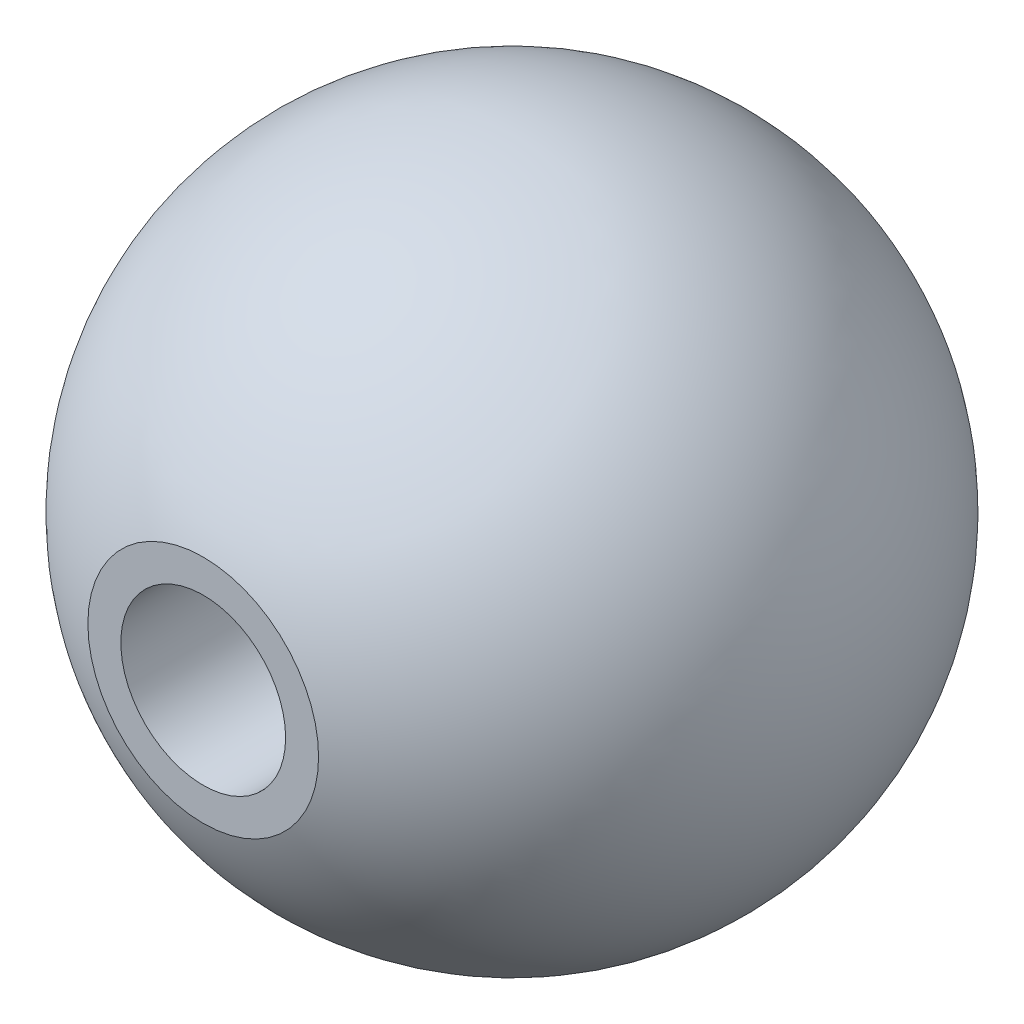
ISO-10303-21;
HEADER;
FILE_DESCRIPTION(('STEP AP214'),'2;1');
FILE_NAME('part.step','',(''),(''),'','','');
FILE_SCHEMA(('AUTOMOTIVE_DESIGN { 1 0 10303 214 1 1 1 1 }'));
ENDSEC;
DATA;
#1=APPLICATION_CONTEXT('core data for automotive mechanical design processes');
#2=APPLICATION_PROTOCOL_DEFINITION('international standard','automotive_design',2000,#1);
#3=PRODUCT_CONTEXT('',#1,'mechanical');
#4=PRODUCT('Part','Part','',(#3));
#5=PRODUCT_RELATED_PRODUCT_CATEGORY('part','',(#4));
#6=PRODUCT_DEFINITION_FORMATION('','',#4);
#7=PRODUCT_DEFINITION_CONTEXT('part definition',#1,'design');
#8=PRODUCT_DEFINITION('design','',#6,#7);
#9=PRODUCT_DEFINITION_SHAPE('','',#8);
#10=(LENGTH_UNIT() NAMED_UNIT(*) SI_UNIT(.MILLI.,.METRE.));
#11=(NAMED_UNIT(*) PLANE_ANGLE_UNIT() SI_UNIT($,.RADIAN.));
#12=(NAMED_UNIT(*) SI_UNIT($,.STERADIAN.) SOLID_ANGLE_UNIT());
#13=UNCERTAINTY_MEASURE_WITH_UNIT(LENGTH_MEASURE(1.E-05),#10,'distance_accuracy_value','');
#14=(GEOMETRIC_REPRESENTATION_CONTEXT(3) GLOBAL_UNCERTAINTY_ASSIGNED_CONTEXT((#13)) GLOBAL_UNIT_ASSIGNED_CONTEXT((#10,
#11,#12)) REPRESENTATION_CONTEXT('',''));
#15=CARTESIAN_POINT('',(0.,0.,0.));
#16=DIRECTION('',(0.,0.,1.));
#17=DIRECTION('',(1.,0.,0.));
#18=AXIS2_PLACEMENT_3D('',#15,#16,#17);
#19=CARTESIAN_POINT('',(0.,0.,0.));
#20=DIRECTION('',(0.,-1.,0.));
#21=DIRECTION('',(1.,0.,0.));
#22=AXIS2_PLACEMENT_3D('',#19,#20,#21);
#23=SPHERICAL_SURFACE('',#22,12.7);
#24=CARTESIAN_POINT('',(0.,0.,0.));
#25=DIRECTION('',(0.,0.,1.));
#26=DIRECTION('',(1.,0.,0.));
#27=AXIS2_PLACEMENT_3D('',#24,#25,#26);
#28=SPHERICAL_SURFACE('',#27,12.7);
#29=CARTESIAN_POINT('',(0.,0.,-11.8967211869489));
#30=DIRECTION('',(0.,0.,1.));
#31=DIRECTION('',(1.,0.,0.));
#32=AXIS2_PLACEMENT_3D('',#29,#30,#31);
#33=CIRCLE('',#32,4.445);
#34=CARTESIAN_POINT('',(4.445,0.,-11.8967211869489));
#35=VERTEX_POINT('',#34);
#36=EDGE_CURVE('E61',#35,#35,#33,.T.);
#37=ORIENTED_EDGE('',*,*,#36,.T.);
#38=EDGE_LOOP('',(#37));
#39=FACE_BOUND('',#38,.T.);
#40=CARTESIAN_POINT('',(0.,0.,11.8967211869489));
#41=DIRECTION('',(0.,0.,-1.));
#42=DIRECTION('',(-1.,0.,0.));
#43=AXIS2_PLACEMENT_3D('',#40,#41,#42);
#44=CIRCLE('',#43,4.445);
#45=CARTESIAN_POINT('',(-4.445,0.,11.8967211869489));
#46=VERTEX_POINT('',#45);
#47=EDGE_CURVE('E10',#46,#46,#44,.T.);
#48=ORIENTED_EDGE('',*,*,#47,.T.);
#49=EDGE_LOOP('',(#48));
#50=FACE_BOUND('',#49,.T.);
#51=ADVANCED_FACE('F43',(#39,#50),#28,.T.);
#52=CARTESIAN_POINT('',(0.,0.,11.8967211869489));
#53=DIRECTION('',(0.,0.,-1.));
#54=DIRECTION('',(-1.,0.,0.));
#55=AXIS2_PLACEMENT_3D('',#52,#53,#54);
#56=PLANE('',#55);
#57=CARTESIAN_POINT('',(0.,0.,11.8967211869489));
#58=DIRECTION('',(0.,0.,1.));
#59=DIRECTION('',(1.,0.,0.));
#60=AXIS2_PLACEMENT_3D('',#57,#58,#59);
#61=CIRCLE('',#60,3.175);
#62=CARTESIAN_POINT('',(3.175,0.,11.8967211869489));
#63=VERTEX_POINT('',#62);
#64=EDGE_CURVE('E55',#63,#63,#61,.T.);
#65=ORIENTED_EDGE('',*,*,#64,.F.);
#66=EDGE_LOOP('',(#65));
#67=FACE_BOUND('',#66,.T.);
#68=ORIENTED_EDGE('',*,*,#47,.F.);
#69=EDGE_LOOP('',(#68));
#70=FACE_BOUND('',#69,.T.);
#71=ADVANCED_FACE('F87',(#67,#70),#56,.F.);
#72=CARTESIAN_POINT('',(0.,0.,4.27672118694895));
#73=DIRECTION('',(0.,0.,1.));
#74=DIRECTION('',(1.,0.,0.));
#75=AXIS2_PLACEMENT_3D('',#72,#73,#74);
#76=CYLINDRICAL_SURFACE('',#75,3.175);
#77=CARTESIAN_POINT('',(0.,0.,4.27672118694895));
#78=DIRECTION('',(0.,0.,1.));
#79=DIRECTION('',(1.,0.,0.));
#80=AXIS2_PLACEMENT_3D('',#77,#78,#79);
#81=CIRCLE('',#80,3.175);
#82=CARTESIAN_POINT('',(3.175,0.,4.27672118694895));
#83=VERTEX_POINT('',#82);
#84=EDGE_CURVE('E50',#83,#83,#81,.T.);
#85=CARTESIAN_POINT('',(3.175,0.,4.27672118694895));
#86=CARTESIAN_POINT('',(3.175,0.,4.35609618694895));
#87=CARTESIAN_POINT('',(3.175,0.,4.43547118694895));
#88=CARTESIAN_POINT('',(3.175,0.,4.59422118694895));
#89=CARTESIAN_POINT('',(3.175,0.,4.67359618694895));
#90=CARTESIAN_POINT('',(3.175,0.,4.83234618694895));
#91=CARTESIAN_POINT('',(3.175,0.,4.91172118694895));
#92=CARTESIAN_POINT('',(3.175,0.,5.07047118694895));
#93=CARTESIAN_POINT('',(3.175,0.,5.14984618694895));
#94=CARTESIAN_POINT('',(3.175,0.,5.30859618694895));
#95=CARTESIAN_POINT('',(3.175,0.,5.38797118694895));
#96=CARTESIAN_POINT('',(3.175,0.,5.54672118694895));
#97=CARTESIAN_POINT('',(3.175,0.,5.62609618694895));
#98=CARTESIAN_POINT('',(3.175,0.,5.78484618694895));
#99=CARTESIAN_POINT('',(3.175,0.,5.86422118694895));
#100=CARTESIAN_POINT('',(3.175,0.,6.02297118694895));
#101=CARTESIAN_POINT('',(3.175,0.,6.10234618694895));
#102=CARTESIAN_POINT('',(3.175,0.,6.26109618694895));
#103=CARTESIAN_POINT('',(3.175,0.,6.34047118694895));
#104=CARTESIAN_POINT('',(3.175,0.,6.49922118694895));
#105=CARTESIAN_POINT('',(3.175,0.,6.57859618694895));
#106=CARTESIAN_POINT('',(3.175,0.,6.73734618694895));
#107=CARTESIAN_POINT('',(3.175,0.,6.81672118694895));
#108=CARTESIAN_POINT('',(3.175,0.,6.97547118694895));
#109=CARTESIAN_POINT('',(3.175,0.,7.05484618694895));
#110=CARTESIAN_POINT('',(3.175,0.,7.21359618694895));
#111=CARTESIAN_POINT('',(3.175,0.,7.29297118694895));
#112=CARTESIAN_POINT('',(3.175,0.,7.45172118694895));
#113=CARTESIAN_POINT('',(3.175,0.,7.53109618694895));
#114=CARTESIAN_POINT('',(3.175,0.,7.68984618694895));
#115=CARTESIAN_POINT('',(3.175,0.,7.76922118694895));
#116=CARTESIAN_POINT('',(3.175,0.,7.92797118694895));
#117=CARTESIAN_POINT('',(3.175,0.,8.00734618694895));
#118=CARTESIAN_POINT('',(3.175,0.,8.16609618694895));
#119=CARTESIAN_POINT('',(3.175,0.,8.24547118694895));
#120=CARTESIAN_POINT('',(3.175,0.,8.40422118694895));
#121=CARTESIAN_POINT('',(3.175,0.,8.48359618694895));
#122=CARTESIAN_POINT('',(3.175,0.,8.64234618694895));
#123=CARTESIAN_POINT('',(3.175,0.,8.72172118694895));
#124=CARTESIAN_POINT('',(3.175,0.,8.88047118694895));
#125=CARTESIAN_POINT('',(3.175,0.,8.95984618694895));
#126=CARTESIAN_POINT('',(3.175,0.,9.11859618694895));
#127=CARTESIAN_POINT('',(3.175,0.,9.19797118694895));
#128=CARTESIAN_POINT('',(3.175,0.,9.35672118694895));
#129=CARTESIAN_POINT('',(3.175,0.,9.43609618694895));
#130=CARTESIAN_POINT('',(3.175,0.,9.59484618694895));
#131=CARTESIAN_POINT('',(3.175,0.,9.67422118694895));
#132=CARTESIAN_POINT('',(3.175,0.,9.83297118694895));
#133=CARTESIAN_POINT('',(3.175,0.,9.91234618694895));
#134=CARTESIAN_POINT('',(3.175,0.,10.0710961869489));
#135=CARTESIAN_POINT('',(3.175,0.,10.1504711869489));
#136=CARTESIAN_POINT('',(3.175,0.,10.3092211869489));
#137=CARTESIAN_POINT('',(3.175,0.,10.3885961869489));
#138=CARTESIAN_POINT('',(3.175,0.,10.5473461869489));
#139=CARTESIAN_POINT('',(3.175,0.,10.6267211869489));
#140=CARTESIAN_POINT('',(3.175,0.,10.7854711869489));
#141=CARTESIAN_POINT('',(3.175,0.,10.8648461869489));
#142=CARTESIAN_POINT('',(3.175,0.,11.0235961869489));
#143=CARTESIAN_POINT('',(3.175,0.,11.1029711869489));
#144=CARTESIAN_POINT('',(3.175,0.,11.2617211869489));
#145=CARTESIAN_POINT('',(3.175,0.,11.3410961869489));
#146=CARTESIAN_POINT('',(3.175,0.,11.4998461869489));
#147=CARTESIAN_POINT('',(3.175,0.,11.5792211869489));
#148=CARTESIAN_POINT('',(3.175,0.,11.7379711869489));
#149=CARTESIAN_POINT('',(3.175,0.,11.8173461869489));
#150=CARTESIAN_POINT('',(3.175,0.,11.8967211869489));
#151=B_SPLINE_CURVE_WITH_KNOTS('',3,(#85,#86,#87,#88,#89,#90,#91,#92,#93,#94,#95,#96,#97,#98,
#99,#100,#101,#102,#103,#104,#105,#106,#107,#108,#109,#110,#111,#112,#113,#114,#115,#116,#117,
#118,#119,#120,#121,#122,#123,#124,#125,#126,#127,#128,#129,#130,#131,#132,#133,#134,#135,#136,
#137,#138,#139,#140,#141,#142,#143,#144,#145,#146,#147,#148,#149,#150),.UNSPECIFIED.,.F.,.F.,(4,
2,2,2,2,2,2,2,2,2,2,2,2,2,2,2,2,2,2,2,2,2,2,2,2,2,2,2,2,2,2,2,4),(0.,0.238125,0.476249999999999,
0.714374999999999,0.952499999999999,1.190625,1.42875,1.666875,1.905,2.143125,2.38125,2.619375,
2.8575,3.095625,3.33375,3.571875,3.81,4.048125,4.28625,4.524375,4.7625,5.000625,5.23875,
5.476875,5.715,5.953125,6.19125,6.429375,6.6675,6.905625,7.14375,7.381875,7.62),.UNSPECIFIED.);
#152=EDGE_CURVE('BSEAM94',#83,#63,#151,.T.);
#153=ORIENTED_EDGE('',*,*,#84,.F.);
#154=ORIENTED_EDGE('',*,*,#64,.T.);
#155=ORIENTED_EDGE('',*,*,#152,.T.);
#156=ORIENTED_EDGE('',*,*,#152,.F.);
#157=EDGE_LOOP('',(#153,#155,#154,#156));
#158=FACE_BOUND('',#157,.T.);
#159=ADVANCED_FACE('F94',(#158),#76,.F.);
#160=CARTESIAN_POINT('',(0.,0.,4.27672118694895));
#161=DIRECTION('',(0.,0.,1.));
#162=DIRECTION('',(1.,0.,0.));
#163=AXIS2_PLACEMENT_3D('',#160,#161,#162);
#164=PLANE('',#163);
#165=ORIENTED_EDGE('',*,*,#84,.T.);
#166=EDGE_LOOP('',(#165));
#167=FACE_BOUND('',#166,.T.);
#168=ADVANCED_FACE('F98',(#167),#164,.T.);
#169=CARTESIAN_POINT('',(0.,0.,-11.8967211869489));
#170=DIRECTION('',(0.,0.,1.));
#171=DIRECTION('',(1.,0.,0.));
#172=AXIS2_PLACEMENT_3D('',#169,#170,#171);
#173=PLANE('',#172);
#174=CARTESIAN_POINT('',(0.,0.,-11.8967211869489));
#175=DIRECTION('',(0.,0.,1.));
#176=DIRECTION('',(1.,0.,0.));
#177=AXIS2_PLACEMENT_3D('',#174,#175,#176);
#178=CIRCLE('',#177,3.175);
#179=CARTESIAN_POINT('',(-3.175,0.,-11.8967211869489));
#180=VERTEX_POINT('',#179);
#181=EDGE_CURVE('E67',#180,#180,#178,.T.);
#182=ORIENTED_EDGE('',*,*,#181,.T.);
#183=EDGE_LOOP('',(#182));
#184=FACE_BOUND('',#183,.T.);
#185=ORIENTED_EDGE('',*,*,#36,.F.);
#186=EDGE_LOOP('',(#185));
#187=FACE_BOUND('',#186,.T.);
#188=ADVANCED_FACE('F84',(#184,#187),#173,.F.);
#189=CARTESIAN_POINT('',(0.,0.,-4.27672118694895));
#190=DIRECTION('',(0.,0.,-1.));
#191=DIRECTION('',(-1.,0.,0.));
#192=AXIS2_PLACEMENT_3D('',#189,#190,#191);
#193=CYLINDRICAL_SURFACE('',#192,3.175);
#194=CARTESIAN_POINT('',(0.,0.,-4.27672118694895));
#195=DIRECTION('',(0.,0.,1.));
#196=DIRECTION('',(1.,0.,0.));
#197=AXIS2_PLACEMENT_3D('',#194,#195,#196);
#198=CIRCLE('',#197,3.175);
#199=CARTESIAN_POINT('',(-3.175,0.,-4.27672118694895));
#200=VERTEX_POINT('',#199);
#201=EDGE_CURVE('E66',#200,#200,#198,.T.);
#202=CARTESIAN_POINT('',(-3.175,0.,-4.27672118694895));
#203=CARTESIAN_POINT('',(-3.175,0.,-4.35609618694895));
#204=CARTESIAN_POINT('',(-3.175,0.,-4.43547118694895));
#205=CARTESIAN_POINT('',(-3.175,0.,-4.59422118694895));
#206=CARTESIAN_POINT('',(-3.175,0.,-4.67359618694895));
#207=CARTESIAN_POINT('',(-3.175,0.,-4.83234618694895));
#208=CARTESIAN_POINT('',(-3.175,0.,-4.91172118694895));
#209=CARTESIAN_POINT('',(-3.175,0.,-5.07047118694895));
#210=CARTESIAN_POINT('',(-3.175,0.,-5.14984618694895));
#211=CARTESIAN_POINT('',(-3.175,0.,-5.30859618694895));
#212=CARTESIAN_POINT('',(-3.175,0.,-5.38797118694895));
#213=CARTESIAN_POINT('',(-3.175,0.,-5.54672118694895));
#214=CARTESIAN_POINT('',(-3.175,0.,-5.62609618694895));
#215=CARTESIAN_POINT('',(-3.175,0.,-5.78484618694895));
#216=CARTESIAN_POINT('',(-3.175,0.,-5.86422118694895));
#217=CARTESIAN_POINT('',(-3.175,0.,-6.02297118694895));
#218=CARTESIAN_POINT('',(-3.175,0.,-6.10234618694895));
#219=CARTESIAN_POINT('',(-3.175,0.,-6.26109618694895));
#220=CARTESIAN_POINT('',(-3.175,0.,-6.34047118694895));
#221=CARTESIAN_POINT('',(-3.175,0.,-6.49922118694895));
#222=CARTESIAN_POINT('',(-3.175,0.,-6.57859618694895));
#223=CARTESIAN_POINT('',(-3.175,0.,-6.73734618694895));
#224=CARTESIAN_POINT('',(-3.175,0.,-6.81672118694895));
#225=CARTESIAN_POINT('',(-3.175,0.,-6.97547118694895));
#226=CARTESIAN_POINT('',(-3.175,0.,-7.05484618694895));
#227=CARTESIAN_POINT('',(-3.175,0.,-7.21359618694895));
#228=CARTESIAN_POINT('',(-3.175,0.,-7.29297118694895));
#229=CARTESIAN_POINT('',(-3.175,0.,-7.45172118694895));
#230=CARTESIAN_POINT('',(-3.175,0.,-7.53109618694895));
#231=CARTESIAN_POINT('',(-3.175,0.,-7.68984618694895));
#232=CARTESIAN_POINT('',(-3.175,0.,-7.76922118694895));
#233=CARTESIAN_POINT('',(-3.175,0.,-7.92797118694895));
#234=CARTESIAN_POINT('',(-3.175,0.,-8.00734618694895));
#235=CARTESIAN_POINT('',(-3.175,0.,-8.16609618694895));
#236=CARTESIAN_POINT('',(-3.175,0.,-8.24547118694895));
#237=CARTESIAN_POINT('',(-3.175,0.,-8.40422118694895));
#238=CARTESIAN_POINT('',(-3.175,0.,-8.48359618694895));
#239=CARTESIAN_POINT('',(-3.175,0.,-8.64234618694895));
#240=CARTESIAN_POINT('',(-3.175,0.,-8.72172118694895));
#241=CARTESIAN_POINT('',(-3.175,0.,-8.88047118694895));
#242=CARTESIAN_POINT('',(-3.175,0.,-8.95984618694895));
#243=CARTESIAN_POINT('',(-3.175,0.,-9.11859618694895));
#244=CARTESIAN_POINT('',(-3.175,0.,-9.19797118694895));
#245=CARTESIAN_POINT('',(-3.175,0.,-9.35672118694895));
#246=CARTESIAN_POINT('',(-3.175,0.,-9.43609618694895));
#247=CARTESIAN_POINT('',(-3.175,0.,-9.59484618694895));
#248=CARTESIAN_POINT('',(-3.175,0.,-9.67422118694895));
#249=CARTESIAN_POINT('',(-3.175,0.,-9.83297118694895));
#250=CARTESIAN_POINT('',(-3.175,0.,-9.91234618694895));
#251=CARTESIAN_POINT('',(-3.175,0.,-10.0710961869489));
#252=CARTESIAN_POINT('',(-3.175,0.,-10.150471186949));
#253=CARTESIAN_POINT('',(-3.175,0.,-10.3092211869489));
#254=CARTESIAN_POINT('',(-3.175,0.,-10.3885961869489));
#255=CARTESIAN_POINT('',(-3.175,0.,-10.5473461869489));
#256=CARTESIAN_POINT('',(-3.175,0.,-10.626721186949));
#257=CARTESIAN_POINT('',(-3.175,0.,-10.7854711869489));
#258=CARTESIAN_POINT('',(-3.175,0.,-10.864846186949));
#259=CARTESIAN_POINT('',(-3.175,0.,-11.023596186949));
#260=CARTESIAN_POINT('',(-3.175,0.,-11.102971186949));
#261=CARTESIAN_POINT('',(-3.175,0.,-11.261721186949));
#262=CARTESIAN_POINT('',(-3.175,0.,-11.341096186949));
#263=CARTESIAN_POINT('',(-3.175,0.,-11.499846186949));
#264=CARTESIAN_POINT('',(-3.175,0.,-11.5792211869489));
#265=CARTESIAN_POINT('',(-3.175,0.,-11.7379711869489));
#266=CARTESIAN_POINT('',(-3.175,0.,-11.817346186949));
#267=CARTESIAN_POINT('',(-3.175,0.,-11.8967211869489));
#268=B_SPLINE_CURVE_WITH_KNOTS('',3,(#202,#203,#204,#205,#206,#207,#208,#209,#210,#211,#212,
#213,#214,#215,#216,#217,#218,#219,#220,#221,#222,#223,#224,#225,#226,#227,#228,#229,#230,#231,
#232,#233,#234,#235,#236,#237,#238,#239,#240,#241,#242,#243,#244,#245,#246,#247,#248,#249,#250,
#251,#252,#253,#254,#255,#256,#257,#258,#259,#260,#261,#262,#263,#264,#265,#266,#267),
.UNSPECIFIED.,.F.,.F.,(4,2,2,2,2,2,2,2,2,2,2,2,2,2,2,2,2,2,2,2,2,2,2,2,2,2,2,2,2,2,2,2,4),(0.,
0.238125,0.47625,0.714375000000001,0.9525,1.190625,1.42875,1.666875,1.905,2.143125,2.38125,
2.619375,2.8575,3.095625,3.33375,3.571875,3.81,4.048125,4.28625,4.524375,4.7625,5.000625,
5.23875,5.476875,5.715,5.953125,6.19125,6.429375,6.6675,6.905625,7.14375,7.381875,7.62),.UNSPECIFIED.);
#269=EDGE_CURVE('BSEAM75',#200,#180,#268,.T.);
#270=ORIENTED_EDGE('',*,*,#201,.T.);
#271=ORIENTED_EDGE('',*,*,#181,.F.);
#272=ORIENTED_EDGE('',*,*,#269,.T.);
#273=ORIENTED_EDGE('',*,*,#269,.F.);
#274=EDGE_LOOP('',(#270,#272,#271,#273));
#275=FACE_BOUND('',#274,.T.);
#276=ADVANCED_FACE('F75',(#275),#193,.F.);
#277=CARTESIAN_POINT('',(0.,0.,-4.27672118694895));
#278=DIRECTION('',(0.,0.,-1.));
#279=DIRECTION('',(1.,0.,0.));
#280=AXIS2_PLACEMENT_3D('',#277,#278,#279);
#281=PLANE('',#280);
#282=ORIENTED_EDGE('',*,*,#201,.F.);
#283=EDGE_LOOP('',(#282));
#284=FACE_BOUND('',#283,.T.);
#285=ADVANCED_FACE('F78',(#284),#281,.T.);
#286=CLOSED_SHELL('',(#51,#71,#159,#168,#188,#276,#285));
#287=MANIFOLD_SOLID_BREP('B2',#286);
#288=ADVANCED_BREP_SHAPE_REPRESENTATION('',(#18,#287),#14);
#289=SHAPE_DEFINITION_REPRESENTATION(#9,#288);
ENDSEC;
END-ISO-10303-21;
